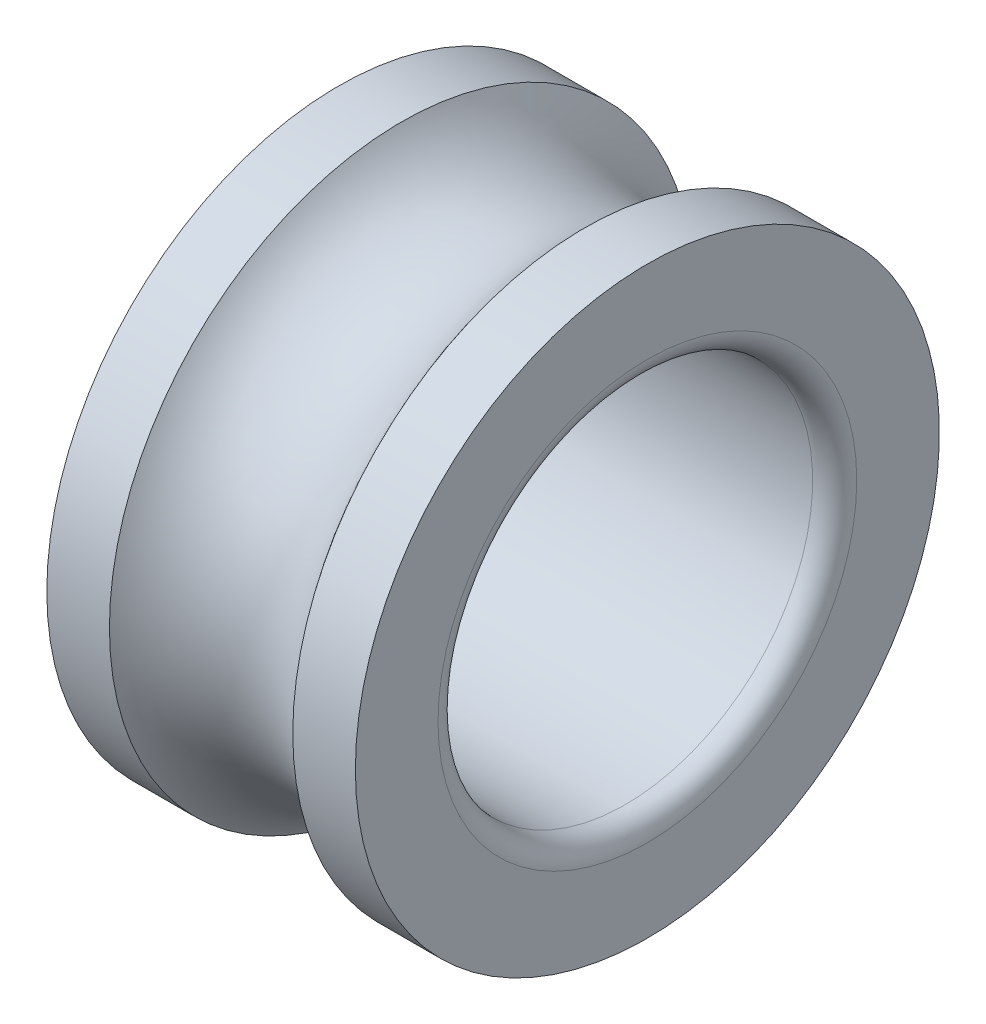
ISO-10303-21;
HEADER;
FILE_DESCRIPTION(('STEP AP214'),'2;1');
FILE_NAME('part.step','',(''),(''),'','','');
FILE_SCHEMA(('AUTOMOTIVE_DESIGN { 1 0 10303 214 1 1 1 1 }'));
ENDSEC;
DATA;
#1=APPLICATION_CONTEXT('core data for automotive mechanical design processes');
#2=APPLICATION_PROTOCOL_DEFINITION('international standard','automotive_design',2000,#1);
#3=PRODUCT_CONTEXT('',#1,'mechanical');
#4=PRODUCT('Part','Part','',(#3));
#5=PRODUCT_RELATED_PRODUCT_CATEGORY('part','',(#4));
#6=PRODUCT_DEFINITION_FORMATION('','',#4);
#7=PRODUCT_DEFINITION_CONTEXT('part definition',#1,'design');
#8=PRODUCT_DEFINITION('design','',#6,#7);
#9=PRODUCT_DEFINITION_SHAPE('','',#8);
#10=(LENGTH_UNIT() NAMED_UNIT(*) SI_UNIT(.MILLI.,.METRE.));
#11=(NAMED_UNIT(*) PLANE_ANGLE_UNIT() SI_UNIT($,.RADIAN.));
#12=(NAMED_UNIT(*) SI_UNIT($,.STERADIAN.) SOLID_ANGLE_UNIT());
#13=UNCERTAINTY_MEASURE_WITH_UNIT(LENGTH_MEASURE(1.E-05),#10,'distance_accuracy_value','');
#14=(GEOMETRIC_REPRESENTATION_CONTEXT(3) GLOBAL_UNCERTAINTY_ASSIGNED_CONTEXT((#13)) GLOBAL_UNIT_ASSIGNED_CONTEXT((#10,
#11,#12)) REPRESENTATION_CONTEXT('',''));
#15=CARTESIAN_POINT('',(0.,0.,0.));
#16=DIRECTION('',(0.,0.,1.));
#17=DIRECTION('',(1.,0.,0.));
#18=AXIS2_PLACEMENT_3D('',#15,#16,#17);
#19=CARTESIAN_POINT('',(0.,0.,0.));
#20=DIRECTION('',(-1.,0.,0.));
#21=DIRECTION('',(0.,0.,1.));
#22=AXIS2_PLACEMENT_3D('',#19,#20,#21);
#23=CYLINDRICAL_SURFACE('',#22,13.25);
#24=CARTESIAN_POINT('',(0.,0.,0.));
#25=DIRECTION('',(-1.,0.,0.));
#26=DIRECTION('',(0.,0.,1.));
#27=AXIS2_PLACEMENT_3D('',#24,#25,#26);
#28=CIRCLE('',#27,13.25);
#29=CARTESIAN_POINT('',(0.,0.,13.25));
#30=VERTEX_POINT('',#29);
#31=EDGE_CURVE('E10',#30,#30,#28,.T.);
#32=ORIENTED_EDGE('',*,*,#31,.F.);
#33=EDGE_LOOP('',(#32));
#34=FACE_BOUND('',#33,.T.);
#35=CARTESIAN_POINT('',(2.84074826441101,0.,0.));
#36=DIRECTION('',(-1.,0.,0.));
#37=DIRECTION('',(0.,0.,1.));
#38=AXIS2_PLACEMENT_3D('',#35,#36,#37);
#39=CIRCLE('',#38,13.25);
#40=CARTESIAN_POINT('',(2.84074826441101,0.,13.25));
#41=VERTEX_POINT('',#40);
#42=EDGE_CURVE('E43',#41,#41,#39,.T.);
#43=ORIENTED_EDGE('',*,*,#42,.T.);
#44=EDGE_LOOP('',(#43));
#45=FACE_BOUND('',#44,.T.);
#46=ADVANCED_FACE('F15',(#34,#45),#23,.T.);
#47=CARTESIAN_POINT('',(0.,13.25,0.));
#48=DIRECTION('',(1.,0.,0.));
#49=DIRECTION('',(0.,0.,-1.));
#50=AXIS2_PLACEMENT_3D('',#47,#48,#49);
#51=PLANE('',#50);
#52=CARTESIAN_POINT('',(0.,0.,0.));
#53=DIRECTION('',(-1.,0.,0.));
#54=DIRECTION('',(0.,0.,1.));
#55=AXIS2_PLACEMENT_3D('',#52,#53,#54);
#56=CIRCLE('',#55,9.5);
#57=CARTESIAN_POINT('',(0.,0.,9.5));
#58=VERTEX_POINT('',#57);
#59=EDGE_CURVE('E21',#58,#58,#56,.T.);
#60=ORIENTED_EDGE('',*,*,#59,.F.);
#61=EDGE_LOOP('',(#60));
#62=FACE_BOUND('',#61,.T.);
#63=ORIENTED_EDGE('',*,*,#31,.T.);
#64=EDGE_LOOP('',(#63));
#65=FACE_BOUND('',#64,.T.);
#66=ADVANCED_FACE('F61',(#62,#65),#51,.F.);
#67=CARTESIAN_POINT('',(1.,0.,0.));
#68=DIRECTION('',(-1.,0.,0.));
#69=DIRECTION('',(0.,0.,1.));
#70=AXIS2_PLACEMENT_3D('',#67,#68,#69);
#71=TOROIDAL_SURFACE('',#70,9.5,1.);
#72=CARTESIAN_POINT('',(1.,0.,0.));
#73=DIRECTION('',(-1.,0.,0.));
#74=DIRECTION('',(0.,0.,1.));
#75=AXIS2_PLACEMENT_3D('',#72,#73,#74);
#76=CIRCLE('',#75,8.5);
#77=CARTESIAN_POINT('',(1.,0.,8.5));
#78=VERTEX_POINT('',#77);
#79=EDGE_CURVE('E25',#78,#78,#76,.T.);
#80=ORIENTED_EDGE('',*,*,#79,.F.);
#81=EDGE_LOOP('',(#80));
#82=FACE_BOUND('',#81,.T.);
#83=ORIENTED_EDGE('',*,*,#59,.T.);
#84=EDGE_LOOP('',(#83));
#85=FACE_BOUND('',#84,.T.);
#86=ADVANCED_FACE('F66',(#82,#85),#71,.T.);
#87=CARTESIAN_POINT('',(0.,0.,0.));
#88=DIRECTION('',(-1.,0.,0.));
#89=DIRECTION('',(0.,0.,1.));
#90=AXIS2_PLACEMENT_3D('',#87,#88,#89);
#91=CYLINDRICAL_SURFACE('',#90,8.5);
#92=CARTESIAN_POINT('',(13.,0.,0.));
#93=DIRECTION('',(-1.,0.,0.));
#94=DIRECTION('',(0.,0.,1.));
#95=AXIS2_PLACEMENT_3D('',#92,#93,#94);
#96=CIRCLE('',#95,8.5);
#97=CARTESIAN_POINT('',(13.,0.,8.5));
#98=VERTEX_POINT('',#97);
#99=EDGE_CURVE('E29',#98,#98,#96,.T.);
#100=ORIENTED_EDGE('',*,*,#99,.F.);
#101=EDGE_LOOP('',(#100));
#102=FACE_BOUND('',#101,.T.);
#103=ORIENTED_EDGE('',*,*,#79,.T.);
#104=EDGE_LOOP('',(#103));
#105=FACE_BOUND('',#104,.T.);
#106=ADVANCED_FACE('F71',(#102,#105),#91,.F.);
#107=CARTESIAN_POINT('',(13.,0.,0.));
#108=DIRECTION('',(-1.,0.,0.));
#109=DIRECTION('',(0.,0.,1.));
#110=AXIS2_PLACEMENT_3D('',#107,#108,#109);
#111=TOROIDAL_SURFACE('',#110,9.5,1.);
#112=CARTESIAN_POINT('',(14.,0.,0.));
#113=DIRECTION('',(-1.,0.,0.));
#114=DIRECTION('',(0.,0.,1.));
#115=AXIS2_PLACEMENT_3D('',#112,#113,#114);
#116=CIRCLE('',#115,9.5);
#117=CARTESIAN_POINT('',(14.,0.,9.5));
#118=VERTEX_POINT('',#117);
#119=EDGE_CURVE('E34',#118,#118,#116,.T.);
#120=ORIENTED_EDGE('',*,*,#119,.F.);
#121=EDGE_LOOP('',(#120));
#122=FACE_BOUND('',#121,.T.);
#123=ORIENTED_EDGE('',*,*,#99,.T.);
#124=EDGE_LOOP('',(#123));
#125=FACE_BOUND('',#124,.T.);
#126=ADVANCED_FACE('F77',(#122,#125),#111,.T.);
#127=CARTESIAN_POINT('',(14.,9.5,0.));
#128=DIRECTION('',(-1.,0.,0.));
#129=DIRECTION('',(0.,0.,1.));
#130=AXIS2_PLACEMENT_3D('',#127,#128,#129);
#131=PLANE('',#130);
#132=CARTESIAN_POINT('',(14.,0.,0.));
#133=DIRECTION('',(-1.,0.,0.));
#134=DIRECTION('',(0.,0.,1.));
#135=AXIS2_PLACEMENT_3D('',#132,#133,#134);
#136=CIRCLE('',#135,13.25);
#137=CARTESIAN_POINT('',(14.,0.,13.25));
#138=VERTEX_POINT('',#137);
#139=EDGE_CURVE('E37',#138,#138,#136,.T.);
#140=ORIENTED_EDGE('',*,*,#139,.F.);
#141=EDGE_LOOP('',(#140));
#142=FACE_BOUND('',#141,.T.);
#143=ORIENTED_EDGE('',*,*,#119,.T.);
#144=EDGE_LOOP('',(#143));
#145=FACE_BOUND('',#144,.T.);
#146=ADVANCED_FACE('F57',(#142,#145),#131,.F.);
#147=CARTESIAN_POINT('',(0.,0.,0.));
#148=DIRECTION('',(-1.,0.,0.));
#149=DIRECTION('',(0.,0.,1.));
#150=AXIS2_PLACEMENT_3D('',#147,#148,#149);
#151=CYLINDRICAL_SURFACE('',#150,13.25);
#152=CARTESIAN_POINT('',(11.159251735589,0.,0.));
#153=DIRECTION('',(-1.,0.,0.));
#154=DIRECTION('',(0.,0.,1.));
#155=AXIS2_PLACEMENT_3D('',#152,#153,#154);
#156=CIRCLE('',#155,13.25);
#157=CARTESIAN_POINT('',(11.159251735589,0.,13.25));
#158=VERTEX_POINT('',#157);
#159=EDGE_CURVE('E40',#158,#158,#156,.T.);
#160=ORIENTED_EDGE('',*,*,#159,.F.);
#161=EDGE_LOOP('',(#160));
#162=FACE_BOUND('',#161,.T.);
#163=ORIENTED_EDGE('',*,*,#139,.T.);
#164=EDGE_LOOP('',(#163));
#165=FACE_BOUND('',#164,.T.);
#166=ADVANCED_FACE('F50',(#162,#165),#151,.T.);
#167=CARTESIAN_POINT('',(7.,0.,0.));
#168=DIRECTION('',(-1.,0.,0.));
#169=DIRECTION('',(0.,0.,1.));
#170=AXIS2_PLACEMENT_3D('',#167,#168,#169);
#171=TOROIDAL_SURFACE('',#170,16.025,5.);
#172=ORIENTED_EDGE('',*,*,#159,.T.);
#173=EDGE_LOOP('',(#172));
#174=FACE_BOUND('',#173,.T.);
#175=ORIENTED_EDGE('',*,*,#42,.F.);
#176=EDGE_LOOP('',(#175));
#177=FACE_BOUND('',#176,.T.);
#178=ADVANCED_FACE('F48',(#174,#177),#171,.F.);
#179=CLOSED_SHELL('',(#46,#66,#86,#106,#126,#146,#166,#178));
#180=MANIFOLD_SOLID_BREP('B1',#179);
#181=ADVANCED_BREP_SHAPE_REPRESENTATION('',(#18,#180),#14);
#182=SHAPE_DEFINITION_REPRESENTATION(#9,#181);
ENDSEC;
END-ISO-10303-21;
